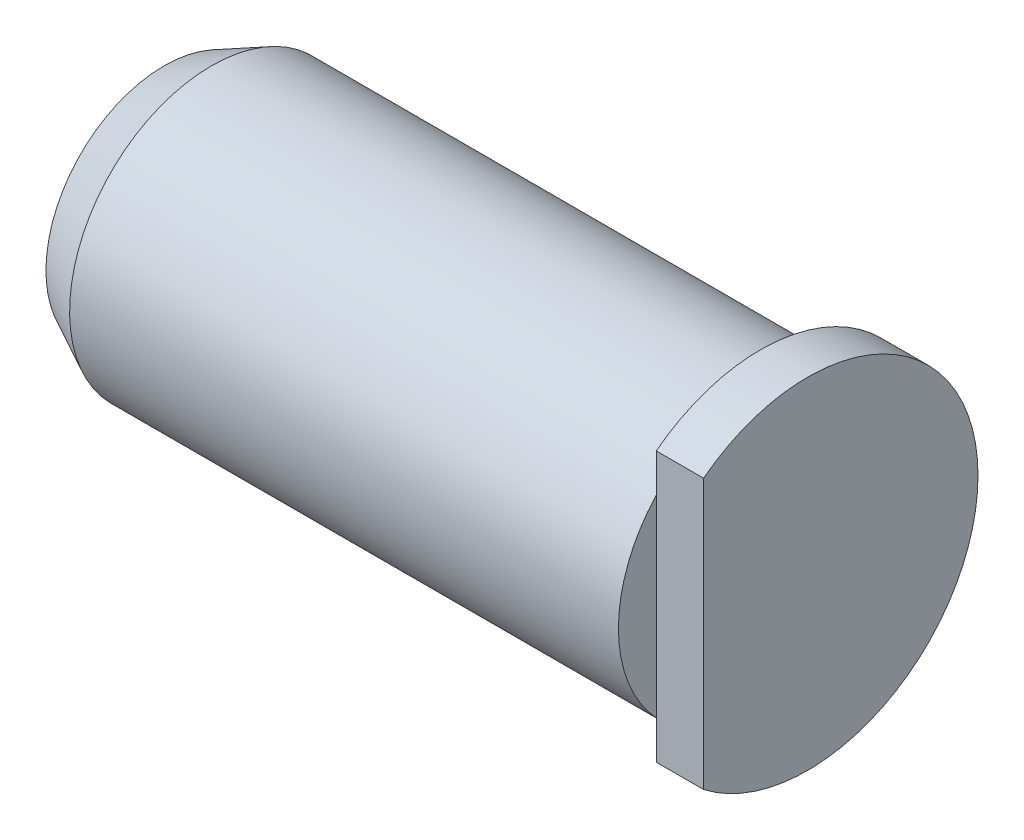
ISO-10303-21;
HEADER;
FILE_DESCRIPTION(('STEP AP214'),'2;1');
FILE_NAME('part.step','',(''),(''),'','','');
FILE_SCHEMA(('AUTOMOTIVE_DESIGN { 1 0 10303 214 1 1 1 1 }'));
ENDSEC;
DATA;
#1=APPLICATION_CONTEXT('core data for automotive mechanical design processes');
#2=APPLICATION_PROTOCOL_DEFINITION('international standard','automotive_design',2000,#1);
#3=PRODUCT_CONTEXT('',#1,'mechanical');
#4=PRODUCT('Part','Part','',(#3));
#5=PRODUCT_RELATED_PRODUCT_CATEGORY('part','',(#4));
#6=PRODUCT_DEFINITION_FORMATION('','',#4);
#7=PRODUCT_DEFINITION_CONTEXT('part definition',#1,'design');
#8=PRODUCT_DEFINITION('design','',#6,#7);
#9=PRODUCT_DEFINITION_SHAPE('','',#8);
#10=(LENGTH_UNIT() NAMED_UNIT(*) SI_UNIT(.MILLI.,.METRE.));
#11=(NAMED_UNIT(*) PLANE_ANGLE_UNIT() SI_UNIT($,.RADIAN.));
#12=(NAMED_UNIT(*) SI_UNIT($,.STERADIAN.) SOLID_ANGLE_UNIT());
#13=UNCERTAINTY_MEASURE_WITH_UNIT(LENGTH_MEASURE(1.E-05),#10,'distance_accuracy_value','');
#14=(GEOMETRIC_REPRESENTATION_CONTEXT(3) GLOBAL_UNCERTAINTY_ASSIGNED_CONTEXT((#13)) GLOBAL_UNIT_ASSIGNED_CONTEXT((#10,
#11,#12)) REPRESENTATION_CONTEXT('',''));
#15=CARTESIAN_POINT('',(0.,0.,0.));
#16=DIRECTION('',(0.,0.,1.));
#17=DIRECTION('',(1.,0.,0.));
#18=AXIS2_PLACEMENT_3D('',#15,#16,#17);
#19=CARTESIAN_POINT('',(0.,0.,0.));
#20=DIRECTION('',(1.,0.,0.));
#21=DIRECTION('',(0.,1.,0.));
#22=AXIS2_PLACEMENT_3D('',#19,#20,#21);
#23=PLANE('',#22);
#24=DIRECTION('',(0.,1.,0.));
#25=VECTOR('',#24,1.);
#26=CARTESIAN_POINT('',(0.,36.,22.));
#27=LINE('',#26,#25);
#28=CARTESIAN_POINT('',(0.,-28.49561369755,22.));
#29=VERTEX_POINT('',#28);
#30=CARTESIAN_POINT('',(0.,28.49561369755,22.));
#31=VERTEX_POINT('',#30);
#32=EDGE_CURVE('E55',#29,#31,#27,.T.);
#33=ORIENTED_EDGE('',*,*,#32,.F.);
#34=CARTESIAN_POINT('',(0.,0.,0.));
#35=DIRECTION('',(1.,0.,0.));
#36=DIRECTION('',(0.,1.,0.));
#37=AXIS2_PLACEMENT_3D('',#34,#35,#36);
#38=CIRCLE('',#37,36.);
#39=EDGE_CURVE('E11',#29,#31,#38,.T.);
#40=ORIENTED_EDGE('',*,*,#39,.T.);
#41=EDGE_LOOP('',(#33,#40));
#42=FACE_BOUND('',#41,.T.);
#43=ADVANCED_FACE('F34',(#42),#23,.T.);
#44=CARTESIAN_POINT('',(0.,0.,0.));
#45=DIRECTION('',(1.,0.,0.));
#46=DIRECTION('',(0.,1.,0.));
#47=AXIS2_PLACEMENT_3D('',#44,#45,#46);
#48=CYLINDRICAL_SURFACE('',#47,36.);
#49=DIRECTION('',(1.,0.,0.));
#50=VECTOR('',#49,1.);
#51=CARTESIAN_POINT('',(0.,28.49561369755,22.));
#52=LINE('',#51,#50);
#53=CARTESIAN_POINT('',(-10.,28.49561369755,22.));
#54=VERTEX_POINT('',#53);
#55=EDGE_CURVE('E80',#31,#54,#52,.F.);
#56=ORIENTED_EDGE('',*,*,#55,.F.);
#57=ORIENTED_EDGE('',*,*,#39,.F.);
#58=DIRECTION('',(1.,0.,0.));
#59=VECTOR('',#58,1.);
#60=CARTESIAN_POINT('',(0.,-28.49561369755,22.));
#61=LINE('',#60,#59);
#62=CARTESIAN_POINT('',(-10.,-28.49561369755,22.));
#63=VERTEX_POINT('',#62);
#64=EDGE_CURVE('E69',#63,#29,#61,.T.);
#65=ORIENTED_EDGE('',*,*,#64,.F.);
#66=CARTESIAN_POINT('',(-9.99999999999999,0.,0.));
#67=DIRECTION('',(1.,0.,0.));
#68=DIRECTION('',(0.,1.,0.));
#69=AXIS2_PLACEMENT_3D('',#66,#67,#68);
#70=CIRCLE('',#69,36.);
#71=EDGE_CURVE('E41',#63,#54,#70,.T.);
#72=ORIENTED_EDGE('',*,*,#71,.T.);
#73=EDGE_LOOP('',(#56,#57,#65,#72));
#74=FACE_BOUND('',#73,.T.);
#75=ADVANCED_FACE('F79',(#74),#48,.T.);
#76=CARTESIAN_POINT('',(-9.99999999999999,36.,0.));
#77=DIRECTION('',(-1.,0.,0.));
#78=DIRECTION('',(0.,-1.,0.));
#79=AXIS2_PLACEMENT_3D('',#76,#77,#78);
#80=PLANE('',#79);
#81=DIRECTION('',(0.,1.,0.));
#82=VECTOR('',#81,1.);
#83=CARTESIAN_POINT('',(-10.,36.,22.));
#84=LINE('',#83,#82);
#85=CARTESIAN_POINT('',(-9.99999999999999,20.3960780543711,22.));
#86=VERTEX_POINT('',#85);
#87=EDGE_CURVE('E75',#86,#54,#84,.T.);
#88=ORIENTED_EDGE('',*,*,#87,.T.);
#89=ORIENTED_EDGE('',*,*,#71,.F.);
#90=CARTESIAN_POINT('',(-10.,-20.3960780543711,22.));
#91=VERTEX_POINT('',#90);
#92=EDGE_CURVE('E66',#63,#91,#84,.T.);
#93=ORIENTED_EDGE('',*,*,#92,.T.);
#94=CARTESIAN_POINT('',(-9.99999999999999,0.,0.));
#95=DIRECTION('',(1.,0.,0.));
#96=DIRECTION('',(0.,1.,0.));
#97=AXIS2_PLACEMENT_3D('',#94,#95,#96);
#98=CIRCLE('',#97,30.);
#99=EDGE_CURVE('E85',#91,#86,#98,.T.);
#100=ORIENTED_EDGE('',*,*,#99,.T.);
#101=EDGE_LOOP('',(#88,#89,#93,#100));
#102=FACE_BOUND('',#101,.T.);
#103=ADVANCED_FACE('F83',(#102),#80,.T.);
#104=CARTESIAN_POINT('',(0.,0.,0.));
#105=DIRECTION('',(1.,0.,0.));
#106=DIRECTION('',(0.,1.,0.));
#107=AXIS2_PLACEMENT_3D('',#104,#105,#106);
#108=CYLINDRICAL_SURFACE('',#107,30.);
#109=CARTESIAN_POINT('',(-126.,0.,0.));
#110=DIRECTION('',(1.,0.,0.));
#111=DIRECTION('',(0.,1.,0.));
#112=AXIS2_PLACEMENT_3D('',#109,#110,#111);
#113=CIRCLE('',#112,30.);
#114=CARTESIAN_POINT('',(-126.,30.,0.));
#115=VERTEX_POINT('',#114);
#116=EDGE_CURVE('E88',#115,#115,#113,.T.);
#117=ORIENTED_EDGE('',*,*,#116,.T.);
#118=EDGE_LOOP('',(#117));
#119=FACE_BOUND('',#118,.T.);
#120=EDGE_CURVE('E84',#86,#91,#98,.T.);
#121=ORIENTED_EDGE('',*,*,#120,.F.);
#122=ORIENTED_EDGE('',*,*,#99,.F.);
#123=EDGE_LOOP('',(#121,#122));
#124=FACE_BOUND('',#123,.T.);
#125=ADVANCED_FACE('F103',(#119,#124),#108,.T.);
#126=CARTESIAN_POINT('',(-126.,0.,0.));
#127=DIRECTION('',(1.,0.,0.));
#128=DIRECTION('',(0.,1.,0.));
#129=AXIS2_PLACEMENT_3D('',#126,#127,#128);
#130=CONICAL_SURFACE('',#129,30.,0.463647609000805);
#131=CARTESIAN_POINT('',(-136.,0.,0.));
#132=DIRECTION('',(1.,0.,0.));
#133=DIRECTION('',(0.,1.,0.));
#134=AXIS2_PLACEMENT_3D('',#131,#132,#133);
#135=CIRCLE('',#134,25.);
#136=CARTESIAN_POINT('',(-136.,25.,0.));
#137=VERTEX_POINT('',#136);
#138=EDGE_CURVE('E91',#137,#137,#135,.T.);
#139=ORIENTED_EDGE('',*,*,#138,.T.);
#140=EDGE_LOOP('',(#139));
#141=FACE_BOUND('',#140,.T.);
#142=ORIENTED_EDGE('',*,*,#116,.F.);
#143=EDGE_LOOP('',(#142));
#144=FACE_BOUND('',#143,.T.);
#145=ADVANCED_FACE('F108',(#141,#144),#130,.T.);
#146=CARTESIAN_POINT('',(-136.,25.,0.));
#147=DIRECTION('',(-1.,0.,0.));
#148=DIRECTION('',(0.,-1.,0.));
#149=AXIS2_PLACEMENT_3D('',#146,#147,#148);
#150=PLANE('',#149);
#151=ORIENTED_EDGE('',*,*,#138,.F.);
#152=EDGE_LOOP('',(#151));
#153=FACE_BOUND('',#152,.T.);
#154=ADVANCED_FACE('F112',(#153),#150,.T.);
#155=CARTESIAN_POINT('',(-10.,36.,22.));
#156=DIRECTION('',(0.,0.,-1.));
#157=DIRECTION('',(0.,1.,0.));
#158=AXIS2_PLACEMENT_3D('',#155,#156,#157);
#159=PLANE('',#158);
#160=ORIENTED_EDGE('',*,*,#55,.T.);
#161=ORIENTED_EDGE('',*,*,#87,.F.);
#162=EDGE_CURVE('E47',#91,#86,#84,.T.);
#163=ORIENTED_EDGE('',*,*,#162,.F.);
#164=ORIENTED_EDGE('',*,*,#92,.F.);
#165=ORIENTED_EDGE('',*,*,#64,.T.);
#166=ORIENTED_EDGE('',*,*,#32,.T.);
#167=EDGE_LOOP('',(#160,#161,#163,#164,#165,#166));
#168=FACE_BOUND('',#167,.T.);
#169=ADVANCED_FACE('F68',(#168),#159,.F.);
#170=CARTESIAN_POINT('',(-10.,0.,0.));
#171=DIRECTION('',(-1.,0.,0.));
#172=DIRECTION('',(0.,-1.,0.));
#173=AXIS2_PLACEMENT_3D('',#170,#171,#172);
#174=PLANE('',#173);
#175=ORIENTED_EDGE('',*,*,#120,.T.);
#176=ORIENTED_EDGE('',*,*,#162,.T.);
#177=EDGE_LOOP('',(#175,#176));
#178=FACE_BOUND('',#177,.T.);
#179=ADVANCED_FACE('F119',(#178),#174,.F.);
#180=CLOSED_SHELL('',(#43,#75,#103,#125,#145,#154,#169,#179));
#181=MANIFOLD_SOLID_BREP('B2',#180);
#182=ADVANCED_BREP_SHAPE_REPRESENTATION('',(#18,#181),#14);
#183=SHAPE_DEFINITION_REPRESENTATION(#9,#182);
ENDSEC;
END-ISO-10303-21;
